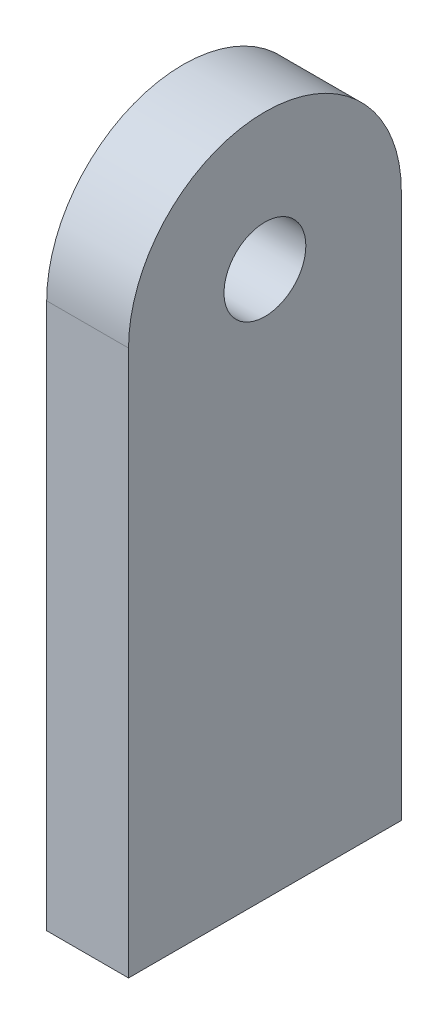
ISO-10303-21;
HEADER;
FILE_DESCRIPTION(('STEP AP214'),'2;1');
FILE_NAME('part.step','',(''),(''),'','','');
FILE_SCHEMA(('AUTOMOTIVE_DESIGN { 1 0 10303 214 1 1 1 1 }'));
ENDSEC;
DATA;
#1=APPLICATION_CONTEXT('core data for automotive mechanical design processes');
#2=APPLICATION_PROTOCOL_DEFINITION('international standard','automotive_design',2000,#1);
#3=PRODUCT_CONTEXT('',#1,'mechanical');
#4=PRODUCT('Part','Part','',(#3));
#5=PRODUCT_RELATED_PRODUCT_CATEGORY('part','',(#4));
#6=PRODUCT_DEFINITION_FORMATION('','',#4);
#7=PRODUCT_DEFINITION_CONTEXT('part definition',#1,'design');
#8=PRODUCT_DEFINITION('design','',#6,#7);
#9=PRODUCT_DEFINITION_SHAPE('','',#8);
#10=(LENGTH_UNIT() NAMED_UNIT(*) SI_UNIT(.MILLI.,.METRE.));
#11=(NAMED_UNIT(*) PLANE_ANGLE_UNIT() SI_UNIT($,.RADIAN.));
#12=(NAMED_UNIT(*) SI_UNIT($,.STERADIAN.) SOLID_ANGLE_UNIT());
#13=UNCERTAINTY_MEASURE_WITH_UNIT(LENGTH_MEASURE(1.E-05),#10,'distance_accuracy_value','');
#14=(GEOMETRIC_REPRESENTATION_CONTEXT(3) GLOBAL_UNCERTAINTY_ASSIGNED_CONTEXT((#13)) GLOBAL_UNIT_ASSIGNED_CONTEXT((#10,
#11,#12)) REPRESENTATION_CONTEXT('',''));
#15=CARTESIAN_POINT('',(0.,0.,0.));
#16=DIRECTION('',(0.,0.,1.));
#17=DIRECTION('',(1.,0.,0.));
#18=AXIS2_PLACEMENT_3D('',#15,#16,#17);
#19=CARTESIAN_POINT('',(6.,40.,-10.));
#20=DIRECTION('',(-1.,0.,0.));
#21=DIRECTION('',(0.,0.,1.));
#22=AXIS2_PLACEMENT_3D('',#19,#20,#21);
#23=PLANE('',#22);
#24=CARTESIAN_POINT('',(6.,40.,-10.));
#25=DIRECTION('',(1.,0.,0.));
#26=DIRECTION('',(0.,0.,1.));
#27=AXIS2_PLACEMENT_3D('',#24,#25,#26);
#28=CIRCLE('',#27,10.);
#29=CARTESIAN_POINT('',(6.,40.,-20.));
#30=VERTEX_POINT('',#29);
#31=CARTESIAN_POINT('',(6.,40.,0.));
#32=VERTEX_POINT('',#31);
#33=EDGE_CURVE('E85',#30,#32,#28,.T.);
#34=ORIENTED_EDGE('',*,*,#33,.T.);
#35=DIRECTION('',(0.,-1.,0.));
#36=VECTOR('',#35,1.);
#37=CARTESIAN_POINT('',(6.,0.,0.));
#38=LINE('',#37,#36);
#39=CARTESIAN_POINT('',(6.,0.,0.));
#40=VERTEX_POINT('',#39);
#41=EDGE_CURVE('E80',#32,#40,#38,.T.);
#42=ORIENTED_EDGE('',*,*,#41,.T.);
#43=DIRECTION('',(0.,0.,-1.));
#44=VECTOR('',#43,1.);
#45=CARTESIAN_POINT('',(6.,0.,-20.));
#46=LINE('',#45,#44);
#47=CARTESIAN_POINT('',(6.,0.,-20.));
#48=VERTEX_POINT('',#47);
#49=EDGE_CURVE('E83',#40,#48,#46,.T.);
#50=ORIENTED_EDGE('',*,*,#49,.T.);
#51=DIRECTION('',(0.,1.,0.));
#52=VECTOR('',#51,1.);
#53=CARTESIAN_POINT('',(6.,40.,-20.));
#54=LINE('',#53,#52);
#55=EDGE_CURVE('E50',#48,#30,#54,.T.);
#56=ORIENTED_EDGE('',*,*,#55,.T.);
#57=EDGE_LOOP('',(#34,#42,#50,#56));
#58=FACE_BOUND('',#57,.T.);
#59=CARTESIAN_POINT('',(6.,40.,-10.));
#60=DIRECTION('',(1.,0.,0.));
#61=DIRECTION('',(0.,0.,-1.));
#62=AXIS2_PLACEMENT_3D('',#59,#60,#61);
#63=CIRCLE('',#62,3.);
#64=CARTESIAN_POINT('',(6.,40.,-13.));
#65=VERTEX_POINT('',#64);
#66=EDGE_CURVE('E100',#65,#65,#63,.T.);
#67=ORIENTED_EDGE('',*,*,#66,.F.);
#68=EDGE_LOOP('',(#67));
#69=FACE_BOUND('',#68,.T.);
#70=ADVANCED_FACE('F33',(#58,#69),#23,.F.);
#71=CARTESIAN_POINT('',(0.,40.,-10.));
#72=DIRECTION('',(-1.,0.,0.));
#73=DIRECTION('',(0.,0.,1.));
#74=AXIS2_PLACEMENT_3D('',#71,#72,#73);
#75=PLANE('',#74);
#76=CARTESIAN_POINT('',(0.,40.,-10.));
#77=DIRECTION('',(1.,0.,0.));
#78=DIRECTION('',(0.,0.,1.));
#79=AXIS2_PLACEMENT_3D('',#76,#77,#78);
#80=CIRCLE('',#79,10.);
#81=CARTESIAN_POINT('',(0.,40.,-20.));
#82=VERTEX_POINT('',#81);
#83=CARTESIAN_POINT('',(0.,40.,0.));
#84=VERTEX_POINT('',#83);
#85=EDGE_CURVE('E97',#82,#84,#80,.T.);
#86=ORIENTED_EDGE('',*,*,#85,.F.);
#87=DIRECTION('',(0.,1.,0.));
#88=VECTOR('',#87,1.);
#89=CARTESIAN_POINT('',(0.,40.,-20.));
#90=LINE('',#89,#88);
#91=CARTESIAN_POINT('',(0.,0.,-20.));
#92=VERTEX_POINT('',#91);
#93=EDGE_CURVE('E73',#92,#82,#90,.T.);
#94=ORIENTED_EDGE('',*,*,#93,.F.);
#95=DIRECTION('',(0.,0.,-1.));
#96=VECTOR('',#95,1.);
#97=CARTESIAN_POINT('',(0.,0.,-20.));
#98=LINE('',#97,#96);
#99=CARTESIAN_POINT('',(0.,0.,0.));
#100=VERTEX_POINT('',#99);
#101=EDGE_CURVE('E67',#100,#92,#98,.T.);
#102=ORIENTED_EDGE('',*,*,#101,.F.);
#103=DIRECTION('',(0.,-1.,0.));
#104=VECTOR('',#103,1.);
#105=CARTESIAN_POINT('',(0.,0.,0.));
#106=LINE('',#105,#104);
#107=EDGE_CURVE('E89',#84,#100,#106,.T.);
#108=ORIENTED_EDGE('',*,*,#107,.F.);
#109=EDGE_LOOP('',(#86,#94,#102,#108));
#110=FACE_BOUND('',#109,.T.);
#111=CARTESIAN_POINT('',(0.,40.,-10.));
#112=DIRECTION('',(1.,0.,0.));
#113=DIRECTION('',(0.,0.,-1.));
#114=AXIS2_PLACEMENT_3D('',#111,#112,#113);
#115=CIRCLE('',#114,3.);
#116=CARTESIAN_POINT('',(0.,40.,-13.));
#117=VERTEX_POINT('',#116);
#118=EDGE_CURVE('E112',#117,#117,#115,.T.);
#119=ORIENTED_EDGE('',*,*,#118,.T.);
#120=EDGE_LOOP('',(#119));
#121=FACE_BOUND('',#120,.T.);
#122=ADVANCED_FACE('F108',(#110,#121),#75,.T.);
#123=CARTESIAN_POINT('',(6.,40.,-10.));
#124=DIRECTION('',(-1.,0.,0.));
#125=DIRECTION('',(0.,0.,1.));
#126=AXIS2_PLACEMENT_3D('',#123,#124,#125);
#127=CYLINDRICAL_SURFACE('',#126,10.);
#128=ORIENTED_EDGE('',*,*,#85,.T.);
#129=DIRECTION('',(-1.,0.,0.));
#130=VECTOR('',#129,1.);
#131=CARTESIAN_POINT('',(6.,40.,0.));
#132=LINE('',#131,#130);
#133=EDGE_CURVE('E11',#32,#84,#132,.T.);
#134=ORIENTED_EDGE('',*,*,#133,.F.);
#135=ORIENTED_EDGE('',*,*,#33,.F.);
#136=DIRECTION('',(-1.,0.,0.));
#137=VECTOR('',#136,1.);
#138=CARTESIAN_POINT('',(6.,40.,-20.));
#139=LINE('',#138,#137);
#140=EDGE_CURVE('E93',#30,#82,#139,.T.);
#141=ORIENTED_EDGE('',*,*,#140,.T.);
#142=EDGE_LOOP('',(#128,#134,#135,#141));
#143=FACE_BOUND('',#142,.T.);
#144=ADVANCED_FACE('F35',(#143),#127,.T.);
#145=CARTESIAN_POINT('',(6.,0.,0.));
#146=DIRECTION('',(0.,0.,-1.));
#147=DIRECTION('',(-1.,0.,0.));
#148=AXIS2_PLACEMENT_3D('',#145,#146,#147);
#149=PLANE('',#148);
#150=ORIENTED_EDGE('',*,*,#107,.T.);
#151=DIRECTION('',(-1.,0.,0.));
#152=VECTOR('',#151,1.);
#153=CARTESIAN_POINT('',(6.,0.,0.));
#154=LINE('',#153,#152);
#155=EDGE_CURVE('E42',#40,#100,#154,.T.);
#156=ORIENTED_EDGE('',*,*,#155,.F.);
#157=ORIENTED_EDGE('',*,*,#41,.F.);
#158=ORIENTED_EDGE('',*,*,#133,.T.);
#159=EDGE_LOOP('',(#150,#156,#157,#158));
#160=FACE_BOUND('',#159,.T.);
#161=ADVANCED_FACE('F88',(#160),#149,.F.);
#162=CARTESIAN_POINT('',(6.,0.,-20.));
#163=DIRECTION('',(0.,1.,0.));
#164=DIRECTION('',(0.,0.,1.));
#165=AXIS2_PLACEMENT_3D('',#162,#163,#164);
#166=PLANE('',#165);
#167=ORIENTED_EDGE('',*,*,#101,.T.);
#168=DIRECTION('',(-1.,0.,0.));
#169=VECTOR('',#168,1.);
#170=CARTESIAN_POINT('',(6.,0.,-20.));
#171=LINE('',#170,#169);
#172=EDGE_CURVE('E90',#48,#92,#171,.T.);
#173=ORIENTED_EDGE('',*,*,#172,.F.);
#174=ORIENTED_EDGE('',*,*,#49,.F.);
#175=ORIENTED_EDGE('',*,*,#155,.T.);
#176=EDGE_LOOP('',(#167,#173,#174,#175));
#177=FACE_BOUND('',#176,.T.);
#178=ADVANCED_FACE('F91',(#177),#166,.F.);
#179=CARTESIAN_POINT('',(6.,40.,-20.));
#180=DIRECTION('',(0.,0.,1.));
#181=DIRECTION('',(0.,-1.,0.));
#182=AXIS2_PLACEMENT_3D('',#179,#180,#181);
#183=PLANE('',#182);
#184=ORIENTED_EDGE('',*,*,#93,.T.);
#185=ORIENTED_EDGE('',*,*,#140,.F.);
#186=ORIENTED_EDGE('',*,*,#55,.F.);
#187=ORIENTED_EDGE('',*,*,#172,.T.);
#188=EDGE_LOOP('',(#184,#185,#186,#187));
#189=FACE_BOUND('',#188,.T.);
#190=ADVANCED_FACE('F105',(#189),#183,.F.);
#191=CARTESIAN_POINT('',(6.,40.,-10.));
#192=DIRECTION('',(-1.,0.,0.));
#193=DIRECTION('',(0.,0.,1.));
#194=AXIS2_PLACEMENT_3D('',#191,#192,#193);
#195=CYLINDRICAL_SURFACE('',#194,3.);
#196=ORIENTED_EDGE('',*,*,#66,.T.);
#197=EDGE_LOOP('',(#196));
#198=FACE_BOUND('',#197,.T.);
#199=ORIENTED_EDGE('',*,*,#118,.F.);
#200=EDGE_LOOP('',(#199));
#201=FACE_BOUND('',#200,.T.);
#202=ADVANCED_FACE('F118',(#198,#201),#195,.F.);
#203=CLOSED_SHELL('',(#70,#122,#144,#161,#178,#190,#202));
#204=MANIFOLD_SOLID_BREP('B2',#203);
#205=ADVANCED_BREP_SHAPE_REPRESENTATION('',(#18,#204),#14);
#206=SHAPE_DEFINITION_REPRESENTATION(#9,#205);
ENDSEC;
END-ISO-10303-21;
